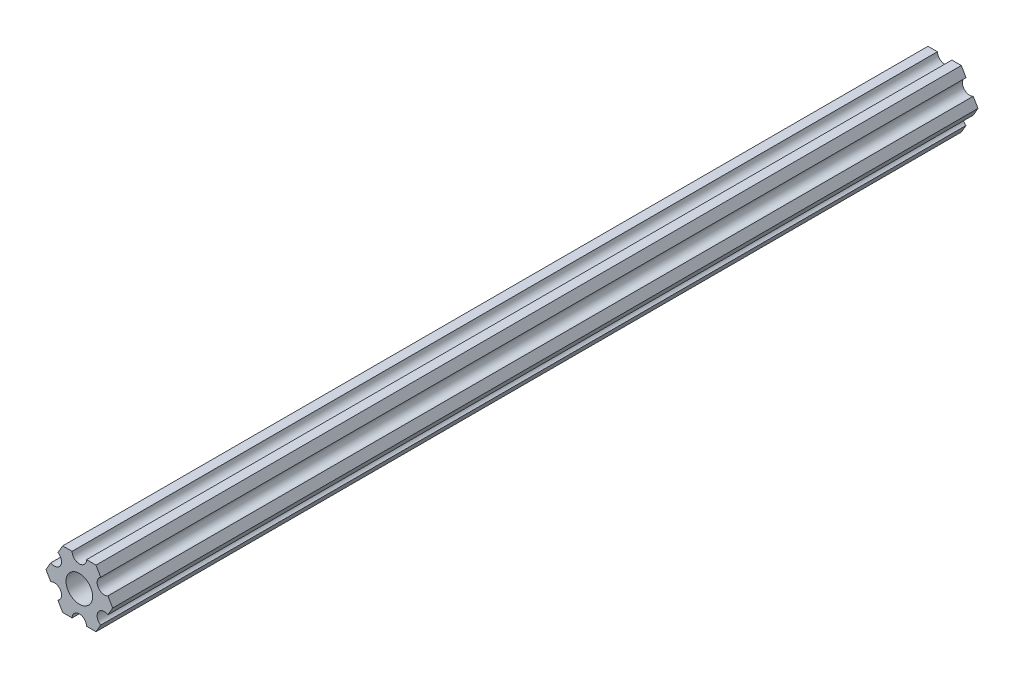
ISO-10303-21;
HEADER;
FILE_DESCRIPTION(('STEP AP214'),'2;1');
FILE_NAME('part.step','',(''),(''),'','','');
FILE_SCHEMA(('AUTOMOTIVE_DESIGN { 1 0 10303 214 1 1 1 1 }'));
ENDSEC;
DATA;
#1=APPLICATION_CONTEXT('core data for automotive mechanical design processes');
#2=APPLICATION_PROTOCOL_DEFINITION('international standard','automotive_design',2000,#1);
#3=PRODUCT_CONTEXT('',#1,'mechanical');
#4=PRODUCT('Part','Part','',(#3));
#5=PRODUCT_RELATED_PRODUCT_CATEGORY('part','',(#4));
#6=PRODUCT_DEFINITION_FORMATION('','',#4);
#7=PRODUCT_DEFINITION_CONTEXT('part definition',#1,'design');
#8=PRODUCT_DEFINITION('design','',#6,#7);
#9=PRODUCT_DEFINITION_SHAPE('','',#8);
#10=(LENGTH_UNIT() NAMED_UNIT(*) SI_UNIT(.MILLI.,.METRE.));
#11=(NAMED_UNIT(*) PLANE_ANGLE_UNIT() SI_UNIT($,.RADIAN.));
#12=(NAMED_UNIT(*) SI_UNIT($,.STERADIAN.) SOLID_ANGLE_UNIT());
#13=UNCERTAINTY_MEASURE_WITH_UNIT(LENGTH_MEASURE(1.E-05),#10,'distance_accuracy_value','');
#14=(GEOMETRIC_REPRESENTATION_CONTEXT(3) GLOBAL_UNCERTAINTY_ASSIGNED_CONTEXT((#13)) GLOBAL_UNIT_ASSIGNED_CONTEXT((#10,
#11,#12)) REPRESENTATION_CONTEXT('',''));
#15=CARTESIAN_POINT('',(0.,0.,0.));
#16=DIRECTION('',(0.,0.,1.));
#17=DIRECTION('',(1.,0.,0.));
#18=AXIS2_PLACEMENT_3D('',#15,#16,#17);
#19=CARTESIAN_POINT('',(6.29301142309098,-1.80018429024546,85.725));
#20=DIRECTION('',(-0.866025434075723,0.499999947533953,0.));
#21=DIRECTION('',(0.,0.,1.));
#22=AXIS2_PLACEMENT_3D('',#19,#20,#21);
#23=PLANE('',#22);
#24=DIRECTION('',(0.,0.,1.));
#25=VECTOR('',#24,1.);
#26=CARTESIAN_POINT('',(7.33234841870827,4.44212519169686E-07,85.725));
#27=LINE('',#26,#25);
#28=CARTESIAN_POINT('',(7.33234841870826,4.44212518961143E-07,-104.648));
#29=VERTEX_POINT('',#28);
#30=CARTESIAN_POINT('',(7.33234841870826,4.44212519315656E-07,85.725));
#31=VERTEX_POINT('',#30);
#32=EDGE_CURVE('E11',#29,#31,#27,.T.);
#33=ORIENTED_EDGE('',*,*,#32,.T.);
#34=DIRECTION('',(0.499999947533953,0.866025434075723,0.));
#35=VECTOR('',#34,1.);
#36=CARTESIAN_POINT('',(6.29301142309098,-1.80018429024546,85.725));
#37=LINE('',#36,#35);
#38=CARTESIAN_POINT('',(6.29301142309098,-1.80018429024546,85.725));
#39=VERTEX_POINT('',#38);
#40=EDGE_CURVE('E339',#39,#31,#37,.T.);
#41=ORIENTED_EDGE('',*,*,#40,.F.);
#42=DIRECTION('',(0.,0.,-1.));
#43=VECTOR('',#42,1.);
#44=CARTESIAN_POINT('',(6.29301142309098,-1.80018429024546,85.725));
#45=LINE('',#44,#43);
#46=CARTESIAN_POINT('',(6.29301142309098,-1.80018429024546,-104.648));
#47=VERTEX_POINT('',#46);
#48=EDGE_CURVE('E338',#39,#47,#45,.T.);
#49=ORIENTED_EDGE('',*,*,#48,.T.);
#50=DIRECTION('',(-0.499999947533953,-0.866025434075723,0.));
#51=VECTOR('',#50,1.);
#52=CARTESIAN_POINT('',(6.29301142309098,-1.80018429024546,-104.648));
#53=LINE('',#52,#51);
#54=EDGE_CURVE('E255',#29,#47,#53,.T.);
#55=ORIENTED_EDGE('',*,*,#54,.F.);
#56=EDGE_LOOP('',(#33,#41,#49,#55));
#57=FACE_BOUND('',#56,.T.);
#58=ADVANCED_FACE('F51',(#57),#23,.F.);
#59=CARTESIAN_POINT('',(7.33234841870827,4.44212519169686E-07,85.725));
#60=DIRECTION('',(-0.866025373493145,-0.500000052466057,0.));
#61=DIRECTION('',(-0.500000052466057,0.866025373493145,0.));
#62=AXIS2_PLACEMENT_3D('',#59,#60,#61);
#63=PLANE('',#62);
#64=DIRECTION('',(0.,0.,1.));
#65=VECTOR('',#64,1.);
#66=CARTESIAN_POINT('',(6.29301120497139,1.80018505273894,85.725));
#67=LINE('',#66,#65);
#68=CARTESIAN_POINT('',(6.29301120497139,1.80018505273894,-104.648));
#69=VERTEX_POINT('',#68);
#70=CARTESIAN_POINT('',(6.29301120497139,1.80018505273894,85.725));
#71=VERTEX_POINT('',#70);
#72=EDGE_CURVE('E60',#69,#71,#67,.T.);
#73=ORIENTED_EDGE('',*,*,#72,.T.);
#74=DIRECTION('',(-0.500000052466057,0.866025373493145,0.));
#75=VECTOR('',#74,1.);
#76=CARTESIAN_POINT('',(7.33234841870827,4.44212519198906E-07,85.725));
#77=LINE('',#76,#75);
#78=EDGE_CURVE('E343',#31,#71,#77,.T.);
#79=ORIENTED_EDGE('',*,*,#78,.F.);
#80=ORIENTED_EDGE('',*,*,#32,.F.);
#81=DIRECTION('',(0.500000052466055,-0.866025373493145,0.));
#82=VECTOR('',#81,1.);
#83=CARTESIAN_POINT('',(7.33234841870826,4.44212518961143E-07,-104.648));
#84=LINE('',#83,#82);
#85=EDGE_CURVE('E249',#69,#29,#84,.T.);
#86=ORIENTED_EDGE('',*,*,#85,.F.);
#87=EDGE_LOOP('',(#73,#79,#80,#86));
#88=FACE_BOUND('',#87,.T.);
#89=ADVANCED_FACE('F250',(#88),#63,.F.);
#90=CARTESIAN_POINT('',(4.70551103839172,4.54981561357972,85.725));
#91=DIRECTION('',(-0.866025373493151,-0.500000052466046,0.));
#92=DIRECTION('',(-0.500000052466046,0.866025373493151,0.));
#93=AXIS2_PLACEMENT_3D('',#90,#91,#92);
#94=PLANE('',#93);
#95=DIRECTION('',(0.,0.,1.));
#96=VECTOR('',#95,1.);
#97=CARTESIAN_POINT('',(3.66617382465481,6.35000022210627,85.725));
#98=LINE('',#97,#96);
#99=CARTESIAN_POINT('',(3.66617382465481,6.35000022210627,-104.648));
#100=VERTEX_POINT('',#99);
#101=CARTESIAN_POINT('',(3.66617382465481,6.35000022210627,85.725));
#102=VERTEX_POINT('',#101);
#103=EDGE_CURVE('E246',#100,#102,#98,.T.);
#104=ORIENTED_EDGE('',*,*,#103,.T.);
#105=DIRECTION('',(-0.500000052466046,0.866025373493151,0.));
#106=VECTOR('',#105,1.);
#107=CARTESIAN_POINT('',(4.70551103839172,4.54981561357972,85.725));
#108=LINE('',#107,#106);
#109=CARTESIAN_POINT('',(4.70551103839172,4.54981561357972,85.725));
#110=VERTEX_POINT('',#109);
#111=EDGE_CURVE('E386',#110,#102,#108,.T.);
#112=ORIENTED_EDGE('',*,*,#111,.F.);
#113=DIRECTION('',(0.,0.,1.));
#114=VECTOR('',#113,1.);
#115=CARTESIAN_POINT('',(4.70551103839172,4.54981561357972,85.725));
#116=LINE('',#115,#114);
#117=CARTESIAN_POINT('',(4.70551103839172,4.54981561357972,-104.648));
#118=VERTEX_POINT('',#117);
#119=EDGE_CURVE('E370',#118,#110,#116,.T.);
#120=ORIENTED_EDGE('',*,*,#119,.F.);
#121=DIRECTION('',(0.500000052466045,-0.866025373493151,0.));
#122=VECTOR('',#121,1.);
#123=CARTESIAN_POINT('',(4.70551103839172,4.54981561357972,-104.648));
#124=LINE('',#123,#122);
#125=EDGE_CURVE('E261',#100,#118,#124,.T.);
#126=ORIENTED_EDGE('',*,*,#125,.F.);
#127=EDGE_LOOP('',(#104,#112,#120,#126));
#128=FACE_BOUND('',#127,.T.);
#129=ADVANCED_FACE('F538',(#128),#94,.F.);
#130=CARTESIAN_POINT('',(3.66617382465481,6.35000022210627,85.725));
#131=DIRECTION('',(6.05825850611185E-08,-1.,0.));
#132=DIRECTION('',(0.,0.,-1.));
#133=AXIS2_PLACEMENT_3D('',#130,#131,#132);
#134=PLANE('',#133);
#135=DIRECTION('',(0.,0.,1.));
#136=VECTOR('',#135,1.);
#137=CARTESIAN_POINT('',(1.58749961530074,6.35000009617482,85.725));
#138=LINE('',#137,#136);
#139=CARTESIAN_POINT('',(1.58749961530073,6.35000015914054,-104.648));
#140=VERTEX_POINT('',#139);
#141=CARTESIAN_POINT('',(1.58749961530073,6.35000015914054,85.725));
#142=VERTEX_POINT('',#141);
#143=EDGE_CURVE('E381',#140,#142,#138,.T.);
#144=ORIENTED_EDGE('',*,*,#143,.T.);
#145=DIRECTION('',(-1.,0.,0.));
#146=VECTOR('',#145,1.);
#147=CARTESIAN_POINT('',(5.49926112168156,6.35000022210627,85.725));
#148=LINE('',#147,#146);
#149=EDGE_CURVE('E390',#102,#142,#148,.T.);
#150=ORIENTED_EDGE('',*,*,#149,.F.);
#151=ORIENTED_EDGE('',*,*,#103,.F.);
#152=DIRECTION('',(1.,3.02912931564594E-08,0.));
#153=VECTOR('',#152,1.);
#154=CARTESIAN_POINT('',(3.66617382465481,6.35000022210627,-104.648));
#155=LINE('',#154,#153);
#156=EDGE_CURVE('E323',#140,#100,#155,.T.);
#157=ORIENTED_EDGE('',*,*,#156,.F.);
#158=EDGE_LOOP('',(#144,#150,#151,#157));
#159=FACE_BOUND('',#158,.T.);
#160=ADVANCED_FACE('F536',(#159),#134,.F.);
#161=CARTESIAN_POINT('',(-3.84699260060323E-07,6.35,85.725));
#162=DIRECTION('',(0.,0.,-1.));
#163=DIRECTION('',(-1.,0.,0.));
#164=AXIS2_PLACEMENT_3D('',#161,#162,#163);
#165=CYLINDRICAL_SURFACE('',#164,1.5875);
#166=DIRECTION('',(0.,0.,1.));
#167=VECTOR('',#166,1.);
#168=CARTESIAN_POINT('',(-1.58750038469926,6.34999990382518,85.725));
#169=LINE('',#168,#167);
#170=CARTESIAN_POINT('',(-1.58750038469926,6.34999990382519,-104.648));
#171=VERTEX_POINT('',#170);
#172=CARTESIAN_POINT('',(-1.58750038469926,6.34999990382519,85.725));
#173=VERTEX_POINT('',#172);
#174=EDGE_CURVE('E378',#171,#173,#169,.T.);
#175=ORIENTED_EDGE('',*,*,#174,.T.);
#176=CARTESIAN_POINT('',(-3.84699260060323E-07,6.35,85.725));
#177=DIRECTION('',(0.,0.,-1.));
#178=DIRECTION('',(-1.,0.,0.));
#179=AXIS2_PLACEMENT_3D('',#176,#177,#178);
#180=CIRCLE('',#179,1.5875);
#181=EDGE_CURVE('E394',#142,#173,#180,.T.);
#182=ORIENTED_EDGE('',*,*,#181,.F.);
#183=ORIENTED_EDGE('',*,*,#143,.F.);
#184=CARTESIAN_POINT('',(-3.84699260060323E-07,6.35,-104.648));
#185=DIRECTION('',(0.,0.,1.));
#186=DIRECTION('',(-1.,0.,0.));
#187=AXIS2_PLACEMENT_3D('',#184,#185,#186);
#188=CIRCLE('',#187,1.5875);
#189=EDGE_CURVE('E319',#171,#140,#188,.T.);
#190=ORIENTED_EDGE('',*,*,#189,.F.);
#191=EDGE_LOOP('',(#175,#182,#183,#190));
#192=FACE_BOUND('',#191,.T.);
#193=ADVANCED_FACE('F532',(#192),#165,.F.);
#194=CARTESIAN_POINT('',(-1.58750038469926,6.34999990382518,85.725));
#195=DIRECTION('',(6.05825963273174E-08,-1.,0.));
#196=DIRECTION('',(0.,0.,-1.));
#197=AXIS2_PLACEMENT_3D('',#194,#195,#196);
#198=PLANE('',#197);
#199=DIRECTION('',(0.,0.,1.));
#200=VECTOR('',#199,1.);
#201=CARTESIAN_POINT('',(-3.66617459405349,6.3499997778937,85.725));
#202=LINE('',#201,#200);
#203=CARTESIAN_POINT('',(-3.66617454558244,6.34999986184803,-104.648));
#204=VERTEX_POINT('',#203);
#205=CARTESIAN_POINT('',(-3.66617454558244,6.34999986184803,85.725));
#206=VERTEX_POINT('',#205);
#207=EDGE_CURVE('E364',#204,#206,#202,.T.);
#208=ORIENTED_EDGE('',*,*,#207,.T.);
#209=DIRECTION('',(-1.,0.,0.));
#210=VECTOR('',#209,1.);
#211=CARTESIAN_POINT('',(5.49926112168156,6.34999990382519,85.725));
#212=LINE('',#211,#210);
#213=EDGE_CURVE('E398',#173,#206,#212,.T.);
#214=ORIENTED_EDGE('',*,*,#213,.F.);
#215=ORIENTED_EDGE('',*,*,#174,.F.);
#216=DIRECTION('',(1.,2.0194198968488E-08,0.));
#217=VECTOR('',#216,1.);
#218=CARTESIAN_POINT('',(-1.58750038469926,6.34999990382519,-104.648));
#219=LINE('',#218,#217);
#220=EDGE_CURVE('E315',#204,#171,#219,.T.);
#221=ORIENTED_EDGE('',*,*,#220,.F.);
#222=EDGE_LOOP('',(#208,#214,#215,#221));
#223=FACE_BOUND('',#222,.T.);
#224=ADVANCED_FACE('F528',(#223),#198,.F.);
#225=CARTESIAN_POINT('',(-3.66617459405349,6.3499997778937,85.725));
#226=DIRECTION('',(0.866025434075729,-0.499999947533942,0.));
#227=DIRECTION('',(0.,0.,-1.));
#228=AXIS2_PLACEMENT_3D('',#225,#226,#227);
#229=PLANE('',#228);
#230=DIRECTION('',(0.,0.,1.));
#231=VECTOR('',#230,1.);
#232=CARTESIAN_POINT('',(-4.70551158967065,4.54981504343587,85.725));
#233=LINE('',#232,#231);
#234=CARTESIAN_POINT('',(-4.70551158967065,4.54981504343587,-104.648));
#235=VERTEX_POINT('',#234);
#236=CARTESIAN_POINT('',(-4.70551158967065,4.54981504343587,85.725));
#237=VERTEX_POINT('',#236);
#238=EDGE_CURVE('E361',#235,#237,#233,.T.);
#239=ORIENTED_EDGE('',*,*,#238,.T.);
#240=DIRECTION('',(-0.499999947533943,-0.866025434075729,0.));
#241=VECTOR('',#240,1.);
#242=CARTESIAN_POINT('',(-3.66617459405349,6.3499997778937,85.725));
#243=LINE('',#242,#241);
#244=EDGE_CURVE('E402',#206,#237,#243,.T.);
#245=ORIENTED_EDGE('',*,*,#244,.F.);
#246=ORIENTED_EDGE('',*,*,#207,.F.);
#247=DIRECTION('',(0.499999947533939,0.866025434075731,0.));
#248=VECTOR('',#247,1.);
#249=CARTESIAN_POINT('',(-3.66617454558244,6.34999986184803,-104.648));
#250=LINE('',#249,#248);
#251=EDGE_CURVE('E311',#235,#204,#250,.T.);
#252=ORIENTED_EDGE('',*,*,#251,.F.);
#253=EDGE_LOOP('',(#239,#245,#246,#252));
#254=FACE_BOUND('',#253,.T.);
#255=ADVANCED_FACE('F524',(#254),#229,.F.);
#256=CARTESIAN_POINT('',(-5.49926150638082,3.17499966684067,85.725));
#257=DIRECTION('',(0.,0.,-1.));
#258=DIRECTION('',(-1.,0.,0.));
#259=AXIS2_PLACEMENT_3D('',#256,#257,#258);
#260=CYLINDRICAL_SURFACE('',#259,1.5875);
#261=DIRECTION('',(0.,0.,1.));
#262=VECTOR('',#261,1.);
#263=CARTESIAN_POINT('',(-6.29301142309098,1.80018429024547,85.725));
#264=LINE('',#263,#262);
#265=CARTESIAN_POINT('',(-6.29301142309098,1.80018429024546,-104.648));
#266=VERTEX_POINT('',#265);
#267=CARTESIAN_POINT('',(-6.29301142309098,1.80018429024547,85.725));
#268=VERTEX_POINT('',#267);
#269=EDGE_CURVE('E365',#266,#268,#264,.T.);
#270=ORIENTED_EDGE('',*,*,#269,.T.);
#271=CARTESIAN_POINT('',(-5.49926150638082,3.17499966684067,85.725));
#272=DIRECTION('',(0.,0.,-1.));
#273=DIRECTION('',(-1.,0.,0.));
#274=AXIS2_PLACEMENT_3D('',#271,#272,#273);
#275=CIRCLE('',#274,1.5875);
#276=EDGE_CURVE('E412',#237,#268,#275,.T.);
#277=ORIENTED_EDGE('',*,*,#276,.F.);
#278=ORIENTED_EDGE('',*,*,#238,.F.);
#279=CARTESIAN_POINT('',(-5.49926150638082,3.17499966684067,-104.648));
#280=DIRECTION('',(0.,0.,1.));
#281=DIRECTION('',(-1.,0.,0.));
#282=AXIS2_PLACEMENT_3D('',#279,#280,#281);
#283=CIRCLE('',#282,1.5875);
#284=EDGE_CURVE('E307',#266,#235,#283,.T.);
#285=ORIENTED_EDGE('',*,*,#284,.F.);
#286=EDGE_LOOP('',(#270,#277,#278,#285));
#287=FACE_BOUND('',#286,.T.);
#288=ADVANCED_FACE('F520',(#287),#260,.F.);
#289=CARTESIAN_POINT('',(-6.29301142309098,1.80018429024547,85.725));
#290=DIRECTION('',(0.866025434075724,-0.499999947533952,0.));
#291=DIRECTION('',(0.,0.,-1.));
#292=AXIS2_PLACEMENT_3D('',#289,#290,#291);
#293=PLANE('',#292);
#294=DIRECTION('',(0.,0.,1.));
#295=VECTOR('',#294,1.);
#296=CARTESIAN_POINT('',(-7.33234841870827,-4.44212523790841E-07,85.725));
#297=LINE('',#296,#295);
#298=CARTESIAN_POINT('',(-7.33234841870826,-4.44212524036367E-07,-104.648));
#299=VERTEX_POINT('',#298);
#300=CARTESIAN_POINT('',(-7.33234841870826,-4.44212524036367E-07,85.725));
#301=VERTEX_POINT('',#300);
#302=EDGE_CURVE('E358',#299,#301,#297,.T.);
#303=ORIENTED_EDGE('',*,*,#302,.T.);
#304=DIRECTION('',(-0.499999947533952,-0.866025434075724,0.));
#305=VECTOR('',#304,1.);
#306=CARTESIAN_POINT('',(-6.29301142309098,1.80018429024547,85.725));
#307=LINE('',#306,#305);
#308=EDGE_CURVE('E408',#268,#301,#307,.T.);
#309=ORIENTED_EDGE('',*,*,#308,.F.);
#310=ORIENTED_EDGE('',*,*,#269,.F.);
#311=DIRECTION('',(0.499999947533951,0.866025434075724,0.));
#312=VECTOR('',#311,1.);
#313=CARTESIAN_POINT('',(-6.29301142309098,1.80018429024547,-104.648));
#314=LINE('',#313,#312);
#315=EDGE_CURVE('E303',#299,#266,#314,.T.);
#316=ORIENTED_EDGE('',*,*,#315,.F.);
#317=EDGE_LOOP('',(#303,#309,#310,#316));
#318=FACE_BOUND('',#317,.T.);
#319=ADVANCED_FACE('F516',(#318),#293,.F.);
#320=CARTESIAN_POINT('',(-7.33234841870827,-4.44212523790841E-07,85.725));
#321=DIRECTION('',(0.866025373493151,0.500000052466045,0.));
#322=DIRECTION('',(0.,0.,-1.));
#323=AXIS2_PLACEMENT_3D('',#320,#321,#322);
#324=PLANE('',#323);
#325=DIRECTION('',(0.,0.,1.));
#326=VECTOR('',#325,1.);
#327=CARTESIAN_POINT('',(-6.29301120497141,-1.80018505273897,85.725));
#328=LINE('',#327,#326);
#329=CARTESIAN_POINT('',(-6.29301120497141,-1.80018505273897,-104.648));
#330=VERTEX_POINT('',#329);
#331=CARTESIAN_POINT('',(-6.29301120497141,-1.80018505273897,85.725));
#332=VERTEX_POINT('',#331);
#333=EDGE_CURVE('E348',#330,#332,#328,.T.);
#334=ORIENTED_EDGE('',*,*,#333,.T.);
#335=DIRECTION('',(0.500000052466045,-0.866025373493151,0.));
#336=VECTOR('',#335,1.);
#337=CARTESIAN_POINT('',(-7.33234841870827,-4.44212523969395E-07,85.725));
#338=LINE('',#337,#336);
#339=EDGE_CURVE('E403',#301,#332,#338,.T.);
#340=ORIENTED_EDGE('',*,*,#339,.F.);
#341=ORIENTED_EDGE('',*,*,#302,.F.);
#342=DIRECTION('',(-0.500000052466045,0.866025373493152,0.));
#343=VECTOR('',#342,1.);
#344=CARTESIAN_POINT('',(-7.33234841870826,-4.44212524036367E-07,-104.648));
#345=LINE('',#344,#343);
#346=EDGE_CURVE('E299',#330,#299,#345,.T.);
#347=ORIENTED_EDGE('',*,*,#346,.F.);
#348=EDGE_LOOP('',(#334,#340,#341,#347));
#349=FACE_BOUND('',#348,.T.);
#350=ADVANCED_FACE('F512',(#349),#324,.F.);
#351=CARTESIAN_POINT('',(-5.49926112168156,-3.17500033315934,85.725));
#352=DIRECTION('',(0.,0.,-1.));
#353=DIRECTION('',(-1.,0.,0.));
#354=AXIS2_PLACEMENT_3D('',#351,#352,#353);
#355=CYLINDRICAL_SURFACE('',#354,1.5875);
#356=DIRECTION('',(0.,0.,1.));
#357=VECTOR('',#356,1.);
#358=CARTESIAN_POINT('',(-4.70551103839172,-4.54981561357972,85.725));
#359=LINE('',#358,#357);
#360=CARTESIAN_POINT('',(-4.70551103839172,-4.54981561357972,-104.648));
#361=VERTEX_POINT('',#360);
#362=CARTESIAN_POINT('',(-4.70551103839172,-4.54981561357972,85.725));
#363=VERTEX_POINT('',#362);
#364=EDGE_CURVE('E345',#361,#363,#359,.T.);
#365=ORIENTED_EDGE('',*,*,#364,.T.);
#366=CARTESIAN_POINT('',(-5.49926112168156,-3.17500033315934,85.725));
#367=DIRECTION('',(0.,0.,-1.));
#368=DIRECTION('',(-1.,0.,0.));
#369=AXIS2_PLACEMENT_3D('',#366,#367,#368);
#370=CIRCLE('',#369,1.5875);
#371=EDGE_CURVE('E407',#332,#363,#370,.T.);
#372=ORIENTED_EDGE('',*,*,#371,.F.);
#373=ORIENTED_EDGE('',*,*,#333,.F.);
#374=CARTESIAN_POINT('',(-5.49926112168156,-3.17500033315934,-104.648));
#375=DIRECTION('',(0.,0.,1.));
#376=DIRECTION('',(-1.,0.,0.));
#377=AXIS2_PLACEMENT_3D('',#374,#375,#376);
#378=CIRCLE('',#377,1.5875);
#379=EDGE_CURVE('E295',#361,#330,#378,.T.);
#380=ORIENTED_EDGE('',*,*,#379,.F.);
#381=EDGE_LOOP('',(#365,#372,#373,#380));
#382=FACE_BOUND('',#381,.T.);
#383=ADVANCED_FACE('F508',(#382),#355,.F.);
#384=CARTESIAN_POINT('',(-4.70551103839172,-4.54981561357972,85.725));
#385=DIRECTION('',(0.866025373493152,0.500000052466045,0.));
#386=DIRECTION('',(0.,0.,-1.));
#387=AXIS2_PLACEMENT_3D('',#384,#385,#386);
#388=PLANE('',#387);
#389=DIRECTION('',(0.,0.,1.));
#390=VECTOR('',#389,1.);
#391=CARTESIAN_POINT('',(-3.66617382465481,-6.35000022210628,85.725));
#392=LINE('',#391,#390);
#393=CARTESIAN_POINT('',(-3.66617382465481,-6.35000022210628,-104.648));
#394=VERTEX_POINT('',#393);
#395=CARTESIAN_POINT('',(-3.66617382465481,-6.35000022210628,85.725));
#396=VERTEX_POINT('',#395);
#397=EDGE_CURVE('E349',#394,#396,#392,.T.);
#398=ORIENTED_EDGE('',*,*,#397,.T.);
#399=DIRECTION('',(0.500000052466045,-0.866025373493151,0.));
#400=VECTOR('',#399,1.);
#401=CARTESIAN_POINT('',(-4.70551103839172,-4.54981561357972,85.725));
#402=LINE('',#401,#400);
#403=EDGE_CURVE('E422',#363,#396,#402,.T.);
#404=ORIENTED_EDGE('',*,*,#403,.F.);
#405=ORIENTED_EDGE('',*,*,#364,.F.);
#406=DIRECTION('',(-0.500000052466043,0.866025373493152,0.));
#407=VECTOR('',#406,1.);
#408=CARTESIAN_POINT('',(-4.70551103839172,-4.54981561357972,-104.648));
#409=LINE('',#408,#407);
#410=EDGE_CURVE('E291',#394,#361,#409,.T.);
#411=ORIENTED_EDGE('',*,*,#410,.F.);
#412=EDGE_LOOP('',(#398,#404,#405,#411));
#413=FACE_BOUND('',#412,.T.);
#414=ADVANCED_FACE('F504',(#413),#388,.F.);
#415=CARTESIAN_POINT('',(-3.66617382465481,-6.35000022210628,85.725));
#416=DIRECTION('',(-6.05825854783851E-08,1.,0.));
#417=DIRECTION('',(0.,0.,1.));
#418=AXIS2_PLACEMENT_3D('',#415,#416,#417);
#419=PLANE('',#418);
#420=DIRECTION('',(0.,0.,1.));
#421=VECTOR('',#420,1.);
#422=CARTESIAN_POINT('',(-1.58749961530074,-6.35,85.725));
#423=LINE('',#422,#421);
#424=CARTESIAN_POINT('',(-1.58749961530073,-6.35000011105314,-104.648));
#425=VERTEX_POINT('',#424);
#426=CARTESIAN_POINT('',(-1.58749961530073,-6.35000011105314,85.725));
#427=VERTEX_POINT('',#426);
#428=EDGE_CURVE('E84',#425,#427,#423,.T.);
#429=ORIENTED_EDGE('',*,*,#428,.T.);
#430=DIRECTION('',(1.,0.,0.));
#431=VECTOR('',#430,1.);
#432=CARTESIAN_POINT('',(5.49926112168156,-6.35000022210628,85.725));
#433=LINE('',#432,#431);
#434=EDGE_CURVE('E426',#396,#427,#433,.T.);
#435=ORIENTED_EDGE('',*,*,#434,.F.);
#436=ORIENTED_EDGE('',*,*,#397,.F.);
#437=DIRECTION('',(-0.999999999999999,-5.34249856349036E-08,0.));
#438=VECTOR('',#437,1.);
#439=CARTESIAN_POINT('',(-3.66617382465481,-6.35000022210628,-104.648));
#440=LINE('',#439,#438);
#441=EDGE_CURVE('E287',#425,#394,#440,.T.);
#442=ORIENTED_EDGE('',*,*,#441,.F.);
#443=EDGE_LOOP('',(#429,#435,#436,#442));
#444=FACE_BOUND('',#443,.T.);
#445=ADVANCED_FACE('F501',(#444),#419,.F.);
#446=CARTESIAN_POINT('',(3.8469926204343E-07,-6.35,85.725));
#447=DIRECTION('',(0.,0.,-1.));
#448=DIRECTION('',(-1.,0.,0.));
#449=AXIS2_PLACEMENT_3D('',#446,#447,#448);
#450=CYLINDRICAL_SURFACE('',#449,1.5875);
#451=DIRECTION('',(0.,0.,1.));
#452=VECTOR('',#451,1.);
#453=CARTESIAN_POINT('',(1.58750038469926,-6.34999990382518,85.725));
#454=LINE('',#453,#452);
#455=CARTESIAN_POINT('',(1.58750038469926,-6.34999990382519,-104.648));
#456=VERTEX_POINT('',#455);
#457=CARTESIAN_POINT('',(1.58750038469926,-6.34999990382519,85.725));
#458=VERTEX_POINT('',#457);
#459=EDGE_CURVE('E73',#456,#458,#454,.T.);
#460=ORIENTED_EDGE('',*,*,#459,.T.);
#461=CARTESIAN_POINT('',(3.8469926204343E-07,-6.35,85.725));
#462=DIRECTION('',(0.,0.,-1.));
#463=DIRECTION('',(-1.,0.,0.));
#464=AXIS2_PLACEMENT_3D('',#461,#462,#463);
#465=CIRCLE('',#464,1.5875);
#466=EDGE_CURVE('E430',#427,#458,#465,.T.);
#467=ORIENTED_EDGE('',*,*,#466,.F.);
#468=ORIENTED_EDGE('',*,*,#428,.F.);
#469=CARTESIAN_POINT('',(3.8469926204343E-07,-6.35,-104.648));
#470=DIRECTION('',(0.,0.,1.));
#471=DIRECTION('',(-1.,0.,0.));
#472=AXIS2_PLACEMENT_3D('',#469,#470,#471);
#473=CIRCLE('',#472,1.5875);
#474=EDGE_CURVE('E283',#456,#425,#473,.T.);
#475=ORIENTED_EDGE('',*,*,#474,.F.);
#476=EDGE_LOOP('',(#460,#467,#468,#475));
#477=FACE_BOUND('',#476,.T.);
#478=ADVANCED_FACE('F499',(#477),#450,.F.);
#479=CARTESIAN_POINT('',(1.58750038469926,-6.34999990382518,85.725));
#480=DIRECTION('',(-6.05825721258438E-08,1.,0.));
#481=DIRECTION('',(0.,0.,1.));
#482=AXIS2_PLACEMENT_3D('',#479,#480,#481);
#483=PLANE('',#482);
#484=DIRECTION('',(0.,0.,1.));
#485=VECTOR('',#484,1.);
#486=CARTESIAN_POINT('',(3.66617459405346,-6.34999977789375,85.725));
#487=LINE('',#486,#485);
#488=CARTESIAN_POINT('',(3.66617454558244,-6.34999986184804,-104.648));
#489=VERTEX_POINT('',#488);
#490=CARTESIAN_POINT('',(3.66617454558244,-6.34999986184804,85.725));
#491=VERTEX_POINT('',#490);
#492=EDGE_CURVE('E431',#489,#491,#487,.T.);
#493=ORIENTED_EDGE('',*,*,#492,.T.);
#494=DIRECTION('',(1.,0.,0.));
#495=VECTOR('',#494,1.);
#496=CARTESIAN_POINT('',(5.49926112168156,-6.34999990382519,85.725));
#497=LINE('',#496,#495);
#498=EDGE_CURVE('E438',#458,#491,#497,.T.);
#499=ORIENTED_EDGE('',*,*,#498,.F.);
#500=ORIENTED_EDGE('',*,*,#459,.F.);
#501=DIRECTION('',(-1.,-2.01941943785532E-08,0.));
#502=VECTOR('',#501,1.);
#503=CARTESIAN_POINT('',(1.58750038469926,-6.34999990382519,-104.648));
#504=LINE('',#503,#502);
#505=EDGE_CURVE('E279',#489,#456,#504,.T.);
#506=ORIENTED_EDGE('',*,*,#505,.F.);
#507=EDGE_LOOP('',(#493,#499,#500,#506));
#508=FACE_BOUND('',#507,.T.);
#509=ADVANCED_FACE('F498',(#508),#483,.F.);
#510=CARTESIAN_POINT('',(3.66617459405346,-6.34999977789375,85.725));
#511=DIRECTION('',(-0.86602543407573,0.499999947533941,0.));
#512=DIRECTION('',(0.,0.,1.));
#513=AXIS2_PLACEMENT_3D('',#510,#511,#512);
#514=PLANE('',#513);
#515=DIRECTION('',(0.,0.,-1.));
#516=VECTOR('',#515,1.);
#517=CARTESIAN_POINT('',(4.70551158967065,-4.54981504343587,85.725));
#518=LINE('',#517,#516);
#519=CARTESIAN_POINT('',(4.70551158967065,-4.54981504343587,85.725));
#520=VERTEX_POINT('',#519);
#521=CARTESIAN_POINT('',(4.70551158967065,-4.54981504343587,-104.648));
#522=VERTEX_POINT('',#521);
#523=EDGE_CURVE('E434',#520,#522,#518,.T.);
#524=ORIENTED_EDGE('',*,*,#523,.F.);
#525=DIRECTION('',(0.49999994753394,0.86602543407573,0.));
#526=VECTOR('',#525,1.);
#527=CARTESIAN_POINT('',(3.66617459405346,-6.34999977789376,85.725));
#528=LINE('',#527,#526);
#529=EDGE_CURVE('E369',#491,#520,#528,.T.);
#530=ORIENTED_EDGE('',*,*,#529,.F.);
#531=ORIENTED_EDGE('',*,*,#492,.F.);
#532=DIRECTION('',(-0.499999947533941,-0.86602543407573,0.));
#533=VECTOR('',#532,1.);
#534=CARTESIAN_POINT('',(3.66617454558244,-6.34999986184804,-104.648));
#535=LINE('',#534,#533);
#536=EDGE_CURVE('E275',#522,#489,#535,.T.);
#537=ORIENTED_EDGE('',*,*,#536,.F.);
#538=EDGE_LOOP('',(#524,#530,#531,#537));
#539=FACE_BOUND('',#538,.T.);
#540=ADVANCED_FACE('F483',(#539),#514,.F.);
#541=CARTESIAN_POINT('',(5.49926112168156,3.17500033315934,85.725));
#542=DIRECTION('',(0.,0.,1.));
#543=DIRECTION('',(1.,0.,0.));
#544=AXIS2_PLACEMENT_3D('',#541,#542,#543);
#545=PLANE('',#544);
#546=CARTESIAN_POINT('',(0.,0.,85.725));
#547=DIRECTION('',(0.,0.,-1.));
#548=DIRECTION('',(-1.,0.,0.));
#549=AXIS2_PLACEMENT_3D('',#546,#547,#548);
#550=CIRCLE('',#549,2.9337);
#551=CARTESIAN_POINT('',(-2.9337,0.,85.725));
#552=VERTEX_POINT('',#551);
#553=CARTESIAN_POINT('',(2.9337,0.,85.725));
#554=VERTEX_POINT('',#553);
#555=EDGE_CURVE('E366',#552,#554,#550,.T.);
#556=ORIENTED_EDGE('',*,*,#555,.T.);
#557=CARTESIAN_POINT('',(0.,0.,85.725));
#558=DIRECTION('',(0.,0.,-1.));
#559=DIRECTION('',(-1.,0.,0.));
#560=AXIS2_PLACEMENT_3D('',#557,#558,#559);
#561=CIRCLE('',#560,2.9337);
#562=EDGE_CURVE('E328',#554,#552,#561,.T.);
#563=ORIENTED_EDGE('',*,*,#562,.T.);
#564=EDGE_LOOP('',(#556,#563));
#565=FACE_BOUND('',#564,.T.);
#566=ORIENTED_EDGE('',*,*,#529,.T.);
#567=CARTESIAN_POINT('',(5.49926150638082,-3.17499966684067,85.725));
#568=DIRECTION('',(0.,0.,-1.));
#569=DIRECTION('',(-1.,0.,0.));
#570=AXIS2_PLACEMENT_3D('',#567,#568,#569);
#571=CIRCLE('',#570,1.5875);
#572=CARTESIAN_POINT('',(3.91176150638082,-3.17499966684067,85.725));
#573=VERTEX_POINT('',#572);
#574=EDGE_CURVE('E344',#520,#573,#571,.T.);
#575=ORIENTED_EDGE('',*,*,#574,.T.);
#576=CARTESIAN_POINT('',(5.49926150638082,-3.17499966684067,85.725));
#577=DIRECTION('',(0.,0.,-1.));
#578=DIRECTION('',(-1.,0.,0.));
#579=AXIS2_PLACEMENT_3D('',#576,#577,#578);
#580=CIRCLE('',#579,1.5875);
#581=EDGE_CURVE('E350',#573,#39,#580,.T.);
#582=ORIENTED_EDGE('',*,*,#581,.T.);
#583=ORIENTED_EDGE('',*,*,#40,.T.);
#584=ORIENTED_EDGE('',*,*,#78,.T.);
#585=CARTESIAN_POINT('',(5.49926112168156,3.17500033315934,85.725));
#586=DIRECTION('',(0.,0.,-1.));
#587=DIRECTION('',(-1.,0.,0.));
#588=AXIS2_PLACEMENT_3D('',#585,#586,#587);
#589=CIRCLE('',#588,1.5875);
#590=CARTESIAN_POINT('',(3.91176112168156,3.17500033315934,85.725));
#591=VERTEX_POINT('',#590);
#592=EDGE_CURVE('E241',#71,#591,#589,.T.);
#593=ORIENTED_EDGE('',*,*,#592,.T.);
#594=CARTESIAN_POINT('',(5.49926112168156,3.17500033315934,85.725));
#595=DIRECTION('',(0.,0.,-1.));
#596=DIRECTION('',(-1.,0.,0.));
#597=AXIS2_PLACEMENT_3D('',#594,#595,#596);
#598=CIRCLE('',#597,1.5875);
#599=EDGE_CURVE('E333',#591,#110,#598,.T.);
#600=ORIENTED_EDGE('',*,*,#599,.T.);
#601=ORIENTED_EDGE('',*,*,#111,.T.);
#602=ORIENTED_EDGE('',*,*,#149,.T.);
#603=ORIENTED_EDGE('',*,*,#181,.T.);
#604=ORIENTED_EDGE('',*,*,#213,.T.);
#605=ORIENTED_EDGE('',*,*,#244,.T.);
#606=ORIENTED_EDGE('',*,*,#276,.T.);
#607=ORIENTED_EDGE('',*,*,#308,.T.);
#608=ORIENTED_EDGE('',*,*,#339,.T.);
#609=ORIENTED_EDGE('',*,*,#371,.T.);
#610=ORIENTED_EDGE('',*,*,#403,.T.);
#611=ORIENTED_EDGE('',*,*,#434,.T.);
#612=ORIENTED_EDGE('',*,*,#466,.T.);
#613=ORIENTED_EDGE('',*,*,#498,.T.);
#614=EDGE_LOOP('',(#566,#575,#582,#583,#584,#593,#600,#601,#602,#603,#604,#605,#606,#607,#608,
#609,#610,#611,#612,#613));
#615=FACE_BOUND('',#614,.T.);
#616=ADVANCED_FACE('F480',(#565,#615),#545,.T.);
#617=CARTESIAN_POINT('',(5.49926112168156,3.17500033315934,85.725));
#618=DIRECTION('',(0.,0.,-1.));
#619=DIRECTION('',(-1.,0.,0.));
#620=AXIS2_PLACEMENT_3D('',#617,#618,#619);
#621=CYLINDRICAL_SURFACE('',#620,1.5875);
#622=ORIENTED_EDGE('',*,*,#599,.F.);
#623=DIRECTION('',(0.,0.,-1.));
#624=VECTOR('',#623,1.);
#625=CARTESIAN_POINT('',(3.91176112168156,3.17500033315934,85.725));
#626=LINE('',#625,#624);
#627=CARTESIAN_POINT('',(3.91176112168156,3.17500033315934,0.));
#628=VERTEX_POINT('',#627);
#629=EDGE_CURVE('E337',#591,#628,#626,.T.);
#630=ORIENTED_EDGE('',*,*,#629,.T.);
#631=ORIENTED_EDGE('',*,*,#629,.F.);
#632=ORIENTED_EDGE('',*,*,#592,.F.);
#633=ORIENTED_EDGE('',*,*,#72,.F.);
#634=CARTESIAN_POINT('',(5.49926112168156,3.17500033315934,-104.648));
#635=DIRECTION('',(0.,0.,1.));
#636=DIRECTION('',(-1.,0.,0.));
#637=AXIS2_PLACEMENT_3D('',#634,#635,#636);
#638=CIRCLE('',#637,1.5875);
#639=EDGE_CURVE('E238',#118,#69,#638,.T.);
#640=ORIENTED_EDGE('',*,*,#639,.F.);
#641=ORIENTED_EDGE('',*,*,#119,.T.);
#642=EDGE_LOOP('',(#622,#630,#631,#632,#633,#640,#641));
#643=FACE_BOUND('',#642,.T.);
#644=ADVANCED_FACE('F235',(#643),#621,.F.);
#645=CARTESIAN_POINT('',(5.49926150638082,-3.17499966684067,85.725));
#646=DIRECTION('',(0.,0.,-1.));
#647=DIRECTION('',(-1.,0.,0.));
#648=AXIS2_PLACEMENT_3D('',#645,#646,#647);
#649=CYLINDRICAL_SURFACE('',#648,1.5875);
#650=ORIENTED_EDGE('',*,*,#581,.F.);
#651=DIRECTION('',(0.,0.,-1.));
#652=VECTOR('',#651,1.);
#653=CARTESIAN_POINT('',(3.91176150638082,-3.17499966684067,85.725));
#654=LINE('',#653,#652);
#655=CARTESIAN_POINT('',(3.91176150638082,-3.17499966684067,0.));
#656=VERTEX_POINT('',#655);
#657=EDGE_CURVE('E354',#573,#656,#654,.T.);
#658=ORIENTED_EDGE('',*,*,#657,.T.);
#659=ORIENTED_EDGE('',*,*,#657,.F.);
#660=ORIENTED_EDGE('',*,*,#574,.F.);
#661=ORIENTED_EDGE('',*,*,#523,.T.);
#662=CARTESIAN_POINT('',(5.49926150638082,-3.17499966684067,-104.648));
#663=DIRECTION('',(0.,0.,1.));
#664=DIRECTION('',(-1.,0.,0.));
#665=AXIS2_PLACEMENT_3D('',#662,#663,#664);
#666=CIRCLE('',#665,1.5875);
#667=EDGE_CURVE('E271',#47,#522,#666,.T.);
#668=ORIENTED_EDGE('',*,*,#667,.F.);
#669=ORIENTED_EDGE('',*,*,#48,.F.);
#670=EDGE_LOOP('',(#650,#658,#659,#660,#661,#668,#669));
#671=FACE_BOUND('',#670,.T.);
#672=ADVANCED_FACE('F493',(#671),#649,.F.);
#673=CARTESIAN_POINT('',(0.,0.,85.725));
#674=DIRECTION('',(0.,0.,-1.));
#675=DIRECTION('',(-1.,0.,0.));
#676=AXIS2_PLACEMENT_3D('',#673,#674,#675);
#677=CYLINDRICAL_SURFACE('',#676,2.9337);
#678=ORIENTED_EDGE('',*,*,#562,.F.);
#679=DIRECTION('',(0.,0.,-1.));
#680=VECTOR('',#679,1.);
#681=CARTESIAN_POINT('',(2.9337,0.,85.725));
#682=LINE('',#681,#680);
#683=CARTESIAN_POINT('',(2.9337,0.,0.));
#684=VERTEX_POINT('',#683);
#685=EDGE_CURVE('E332',#554,#684,#682,.T.);
#686=ORIENTED_EDGE('',*,*,#685,.T.);
#687=ORIENTED_EDGE('',*,*,#685,.F.);
#688=ORIENTED_EDGE('',*,*,#555,.F.);
#689=DIRECTION('',(0.,0.,-1.));
#690=VECTOR('',#689,1.);
#691=CARTESIAN_POINT('',(-2.9337,0.,85.725));
#692=LINE('',#691,#690);
#693=CARTESIAN_POINT('',(-2.9337,0.,0.));
#694=VERTEX_POINT('',#693);
#695=EDGE_CURVE('E355',#552,#694,#692,.T.);
#696=ORIENTED_EDGE('',*,*,#695,.T.);
#697=ORIENTED_EDGE('',*,*,#695,.F.);
#698=EDGE_LOOP('',(#678,#686,#687,#688,#696,#697));
#699=FACE_BOUND('',#698,.T.);
#700=CARTESIAN_POINT('',(0.,0.,-104.648));
#701=DIRECTION('',(0.,0.,-1.));
#702=DIRECTION('',(-1.,0.,0.));
#703=AXIS2_PLACEMENT_3D('',#700,#701,#702);
#704=CIRCLE('',#703,2.9337);
#705=CARTESIAN_POINT('',(-2.9337,0.,-104.648));
#706=VERTEX_POINT('',#705);
#707=EDGE_CURVE('E263',#706,#706,#704,.T.);
#708=ORIENTED_EDGE('',*,*,#707,.T.);
#709=EDGE_LOOP('',(#708));
#710=FACE_BOUND('',#709,.T.);
#711=ADVANCED_FACE('F476',(#699,#710),#677,.F.);
#712=CARTESIAN_POINT('',(5.49926112168156,3.17500033315934,-104.648));
#713=DIRECTION('',(0.,0.,-1.));
#714=DIRECTION('',(-1.,0.,0.));
#715=AXIS2_PLACEMENT_3D('',#712,#713,#714);
#716=PLANE('',#715);
#717=ORIENTED_EDGE('',*,*,#639,.T.);
#718=ORIENTED_EDGE('',*,*,#85,.T.);
#719=ORIENTED_EDGE('',*,*,#54,.T.);
#720=ORIENTED_EDGE('',*,*,#667,.T.);
#721=ORIENTED_EDGE('',*,*,#536,.T.);
#722=ORIENTED_EDGE('',*,*,#505,.T.);
#723=ORIENTED_EDGE('',*,*,#474,.T.);
#724=ORIENTED_EDGE('',*,*,#441,.T.);
#725=ORIENTED_EDGE('',*,*,#410,.T.);
#726=ORIENTED_EDGE('',*,*,#379,.T.);
#727=ORIENTED_EDGE('',*,*,#346,.T.);
#728=ORIENTED_EDGE('',*,*,#315,.T.);
#729=ORIENTED_EDGE('',*,*,#284,.T.);
#730=ORIENTED_EDGE('',*,*,#251,.T.);
#731=ORIENTED_EDGE('',*,*,#220,.T.);
#732=ORIENTED_EDGE('',*,*,#189,.T.);
#733=ORIENTED_EDGE('',*,*,#156,.T.);
#734=ORIENTED_EDGE('',*,*,#125,.T.);
#735=EDGE_LOOP('',(#717,#718,#719,#720,#721,#722,#723,#724,#725,#726,#727,#728,#729,#730,#731,
#732,#733,#734));
#736=FACE_BOUND('',#735,.T.);
#737=ORIENTED_EDGE('',*,*,#707,.F.);
#738=EDGE_LOOP('',(#737));
#739=FACE_BOUND('',#738,.T.);
#740=ADVANCED_FACE('F257',(#736,#739),#716,.T.);
#741=CLOSED_SHELL('',(#58,#89,#129,#160,#193,#224,#255,#288,#319,#350,#383,#414,#445,#478,#509,
#540,#616,#644,#672,#711,#740));
#742=MANIFOLD_SOLID_BREP('B2',#741);
#743=ADVANCED_BREP_SHAPE_REPRESENTATION('',(#18,#742),#14);
#744=SHAPE_DEFINITION_REPRESENTATION(#9,#743);
ENDSEC;
END-ISO-10303-21;
